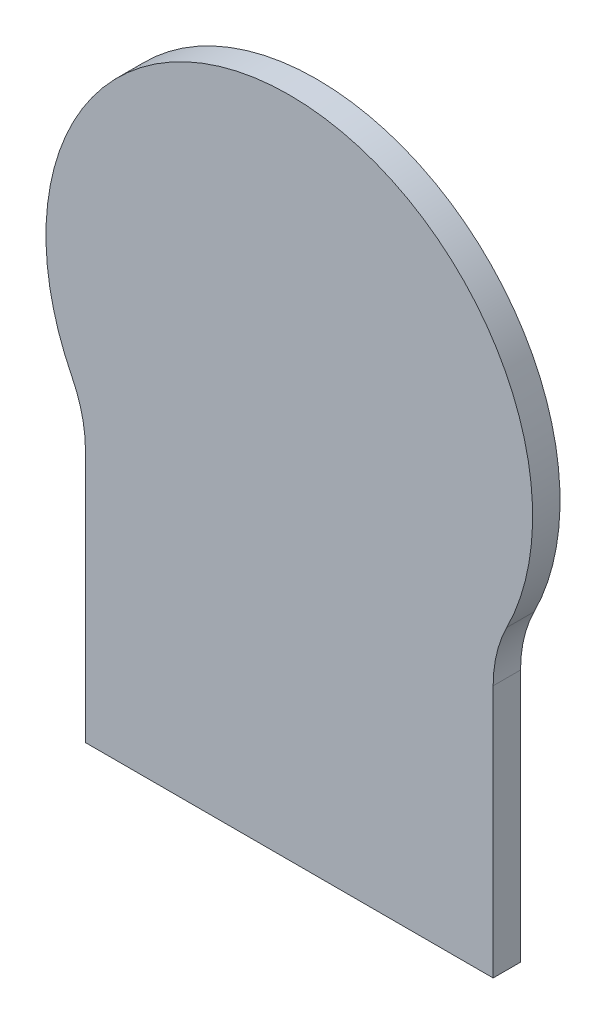
ISO-10303-21;
HEADER;
FILE_DESCRIPTION(('STEP AP214'),'2;1');
FILE_NAME('part.step','',(''),(''),'','','');
FILE_SCHEMA(('AUTOMOTIVE_DESIGN { 1 0 10303 214 1 1 1 1 }'));
ENDSEC;
DATA;
#1=APPLICATION_CONTEXT('core data for automotive mechanical design processes');
#2=APPLICATION_PROTOCOL_DEFINITION('international standard','automotive_design',2000,#1);
#3=PRODUCT_CONTEXT('',#1,'mechanical');
#4=PRODUCT('Part','Part','',(#3));
#5=PRODUCT_RELATED_PRODUCT_CATEGORY('part','',(#4));
#6=PRODUCT_DEFINITION_FORMATION('','',#4);
#7=PRODUCT_DEFINITION_CONTEXT('part definition',#1,'design');
#8=PRODUCT_DEFINITION('design','',#6,#7);
#9=PRODUCT_DEFINITION_SHAPE('','',#8);
#10=(LENGTH_UNIT() NAMED_UNIT(*) SI_UNIT(.MILLI.,.METRE.));
#11=(NAMED_UNIT(*) PLANE_ANGLE_UNIT() SI_UNIT($,.RADIAN.));
#12=(NAMED_UNIT(*) SI_UNIT($,.STERADIAN.) SOLID_ANGLE_UNIT());
#13=UNCERTAINTY_MEASURE_WITH_UNIT(LENGTH_MEASURE(1.E-05),#10,'distance_accuracy_value','');
#14=(GEOMETRIC_REPRESENTATION_CONTEXT(3) GLOBAL_UNCERTAINTY_ASSIGNED_CONTEXT((#13)) GLOBAL_UNIT_ASSIGNED_CONTEXT((#10,
#11,#12)) REPRESENTATION_CONTEXT('',''));
#15=CARTESIAN_POINT('',(0.,0.,0.));
#16=DIRECTION('',(0.,0.,1.));
#17=DIRECTION('',(1.,0.,0.));
#18=AXIS2_PLACEMENT_3D('',#15,#16,#17);
#19=CARTESIAN_POINT('',(0.,0.,0.43));
#20=DIRECTION('',(0.,0.,-1.));
#21=DIRECTION('',(-1.,0.,0.));
#22=AXIS2_PLACEMENT_3D('',#19,#20,#21);
#23=CYLINDRICAL_SURFACE('',#22,3.82);
#24=CARTESIAN_POINT('',(0.,0.,0.));
#25=DIRECTION('',(0.,0.,1.));
#26=DIRECTION('',(1.,0.,0.));
#27=AXIS2_PLACEMENT_3D('',#24,#25,#26);
#28=CIRCLE('',#27,3.82);
#29=CARTESIAN_POINT('',(3.41305841924399,-1.71564338568006,0.));
#30=VERTEX_POINT('',#29);
#31=CARTESIAN_POINT('',(-3.41305841924399,-1.71564338568006,0.));
#32=VERTEX_POINT('',#31);
#33=EDGE_CURVE('E117',#30,#32,#28,.T.);
#34=ORIENTED_EDGE('',*,*,#33,.T.);
#35=DIRECTION('',(0.,0.,-1.));
#36=VECTOR('',#35,1.);
#37=CARTESIAN_POINT('',(-3.41305841924399,-1.71564338568006,0.43));
#38=LINE('',#37,#36);
#39=CARTESIAN_POINT('',(-3.41305841924399,-1.71564338568006,0.43));
#40=VERTEX_POINT('',#39);
#41=EDGE_CURVE('E129',#32,#40,#38,.F.);
#42=ORIENTED_EDGE('',*,*,#41,.T.);
#43=CARTESIAN_POINT('',(0.,0.,0.43));
#44=DIRECTION('',(0.,0.,1.));
#45=DIRECTION('',(1.,0.,0.));
#46=AXIS2_PLACEMENT_3D('',#43,#44,#45);
#47=CIRCLE('',#46,3.82);
#48=CARTESIAN_POINT('',(3.41305841924399,-1.71564338568006,0.43));
#49=VERTEX_POINT('',#48);
#50=EDGE_CURVE('E111',#49,#40,#47,.T.);
#51=ORIENTED_EDGE('',*,*,#50,.F.);
#52=DIRECTION('',(0.,0.,-1.));
#53=VECTOR('',#52,1.);
#54=CARTESIAN_POINT('',(3.41305841924399,-1.71564338568006,0.43));
#55=LINE('',#54,#53);
#56=EDGE_CURVE('E126',#49,#30,#55,.T.);
#57=ORIENTED_EDGE('',*,*,#56,.T.);
#58=EDGE_LOOP('',(#34,#42,#51,#57));
#59=FACE_BOUND('',#58,.T.);
#60=ADVANCED_FACE('F33',(#59),#23,.T.);
#61=CARTESIAN_POINT('',(-3.2,0.,0.43));
#62=DIRECTION('',(-1.,0.,0.));
#63=DIRECTION('',(0.,0.,1.));
#64=AXIS2_PLACEMENT_3D('',#61,#62,#63);
#65=PLANE('',#64);
#66=DIRECTION('',(0.,1.,0.));
#67=VECTOR('',#66,1.);
#68=CARTESIAN_POINT('',(-3.2,0.,0.43));
#69=LINE('',#68,#67);
#70=CARTESIAN_POINT('',(-3.2,-6.58624063808564,0.43));
#71=VERTEX_POINT('',#70);
#72=CARTESIAN_POINT('',(-3.2,-2.61388599598376,0.43));
#73=VERTEX_POINT('',#72);
#74=EDGE_CURVE('E91',#71,#73,#69,.T.);
#75=ORIENTED_EDGE('',*,*,#74,.T.);
#76=DIRECTION('',(0.,0.,-1.));
#77=VECTOR('',#76,1.);
#78=CARTESIAN_POINT('',(-3.2,-2.61388599598376,0.43));
#79=LINE('',#78,#77);
#80=CARTESIAN_POINT('',(-3.2,-2.61388599598376,0.));
#81=VERTEX_POINT('',#80);
#82=EDGE_CURVE('E97',#73,#81,#79,.T.);
#83=ORIENTED_EDGE('',*,*,#82,.T.);
#84=DIRECTION('',(0.,1.,0.));
#85=VECTOR('',#84,1.);
#86=CARTESIAN_POINT('',(-3.2,0.,0.));
#87=LINE('',#86,#85);
#88=CARTESIAN_POINT('',(-3.2,-6.58624063808564,0.));
#89=VERTEX_POINT('',#88);
#90=EDGE_CURVE('E94',#89,#81,#87,.T.);
#91=ORIENTED_EDGE('',*,*,#90,.F.);
#92=DIRECTION('',(0.,0.,-1.));
#93=VECTOR('',#92,1.);
#94=CARTESIAN_POINT('',(-3.2,-6.58624063808564,0.43));
#95=LINE('',#94,#93);
#96=EDGE_CURVE('E86',#71,#89,#95,.T.);
#97=ORIENTED_EDGE('',*,*,#96,.F.);
#98=EDGE_LOOP('',(#75,#83,#91,#97));
#99=FACE_BOUND('',#98,.T.);
#100=ADVANCED_FACE('F88',(#99),#65,.T.);
#101=CARTESIAN_POINT('',(0.,-6.58624063808564,0.43));
#102=DIRECTION('',(0.,1.,0.));
#103=DIRECTION('',(0.,0.,1.));
#104=AXIS2_PLACEMENT_3D('',#101,#102,#103);
#105=PLANE('',#104);
#106=DIRECTION('',(1.,0.,0.));
#107=VECTOR('',#106,1.);
#108=CARTESIAN_POINT('',(0.,-6.58624063808564,0.));
#109=LINE('',#108,#107);
#110=CARTESIAN_POINT('',(3.2,-6.58624063808564,0.));
#111=VERTEX_POINT('',#110);
#112=EDGE_CURVE('E121',#89,#111,#109,.T.);
#113=ORIENTED_EDGE('',*,*,#112,.T.);
#114=DIRECTION('',(0.,0.,-1.));
#115=VECTOR('',#114,1.);
#116=CARTESIAN_POINT('',(3.2,-6.58624063808564,0.43));
#117=LINE('',#116,#115);
#118=CARTESIAN_POINT('',(3.2,-6.58624063808564,0.43));
#119=VERTEX_POINT('',#118);
#120=EDGE_CURVE('E98',#119,#111,#117,.T.);
#121=ORIENTED_EDGE('',*,*,#120,.F.);
#122=DIRECTION('',(1.,0.,0.));
#123=VECTOR('',#122,1.);
#124=CARTESIAN_POINT('',(0.,-6.58624063808564,0.43));
#125=LINE('',#124,#123);
#126=EDGE_CURVE('E101',#71,#119,#125,.T.);
#127=ORIENTED_EDGE('',*,*,#126,.F.);
#128=ORIENTED_EDGE('',*,*,#96,.T.);
#129=EDGE_LOOP('',(#113,#121,#127,#128));
#130=FACE_BOUND('',#129,.T.);
#131=ADVANCED_FACE('F102',(#130),#105,.F.);
#132=CARTESIAN_POINT('',(3.2,0.,0.43));
#133=DIRECTION('',(-1.,0.,0.));
#134=DIRECTION('',(0.,0.,1.));
#135=AXIS2_PLACEMENT_3D('',#132,#133,#134);
#136=PLANE('',#135);
#137=DIRECTION('',(0.,1.,0.));
#138=VECTOR('',#137,1.);
#139=CARTESIAN_POINT('',(3.2,0.,0.));
#140=LINE('',#139,#138);
#141=CARTESIAN_POINT('',(3.2,-2.61388599598376,0.));
#142=VERTEX_POINT('',#141);
#143=EDGE_CURVE('E113',#111,#142,#140,.T.);
#144=ORIENTED_EDGE('',*,*,#143,.T.);
#145=DIRECTION('',(0.,0.,1.));
#146=VECTOR('',#145,1.);
#147=CARTESIAN_POINT('',(3.2,-2.61388599598376,0.43));
#148=LINE('',#147,#146);
#149=CARTESIAN_POINT('',(3.2,-2.61388599598376,0.43));
#150=VERTEX_POINT('',#149);
#151=EDGE_CURVE('E48',#142,#150,#148,.T.);
#152=ORIENTED_EDGE('',*,*,#151,.T.);
#153=DIRECTION('',(0.,1.,0.));
#154=VECTOR('',#153,1.);
#155=CARTESIAN_POINT('',(3.2,0.,0.43));
#156=LINE('',#155,#154);
#157=EDGE_CURVE('E105',#119,#150,#156,.T.);
#158=ORIENTED_EDGE('',*,*,#157,.F.);
#159=ORIENTED_EDGE('',*,*,#120,.T.);
#160=EDGE_LOOP('',(#144,#152,#158,#159));
#161=FACE_BOUND('',#160,.T.);
#162=ADVANCED_FACE('F157',(#161),#136,.F.);
#163=CARTESIAN_POINT('',(0.,0.,0.43));
#164=DIRECTION('',(0.,0.,1.));
#165=DIRECTION('',(1.,0.,0.));
#166=AXIS2_PLACEMENT_3D('',#163,#164,#165);
#167=PLANE('',#166);
#168=ORIENTED_EDGE('',*,*,#157,.T.);
#169=CARTESIAN_POINT('',(5.2,-2.61388599598376,0.43));
#170=DIRECTION('',(0.,0.,1.));
#171=DIRECTION('',(1.,0.,0.));
#172=AXIS2_PLACEMENT_3D('',#169,#170,#171);
#173=CIRCLE('',#172,2.);
#174=EDGE_CURVE('E11',#150,#49,#173,.F.);
#175=ORIENTED_EDGE('',*,*,#174,.T.);
#176=ORIENTED_EDGE('',*,*,#50,.T.);
#177=CARTESIAN_POINT('',(-5.2,-2.61388599598376,0.43));
#178=DIRECTION('',(0.,0.,1.));
#179=DIRECTION('',(1.,0.,0.));
#180=AXIS2_PLACEMENT_3D('',#177,#178,#179);
#181=CIRCLE('',#180,2.);
#182=EDGE_CURVE('E110',#40,#73,#181,.F.);
#183=ORIENTED_EDGE('',*,*,#182,.T.);
#184=ORIENTED_EDGE('',*,*,#74,.F.);
#185=ORIENTED_EDGE('',*,*,#126,.T.);
#186=EDGE_LOOP('',(#168,#175,#176,#183,#184,#185));
#187=FACE_BOUND('',#186,.T.);
#188=ADVANCED_FACE('F107',(#187),#167,.T.);
#189=CARTESIAN_POINT('',(0.,0.,0.));
#190=DIRECTION('',(0.,0.,1.));
#191=DIRECTION('',(1.,0.,0.));
#192=AXIS2_PLACEMENT_3D('',#189,#190,#191);
#193=PLANE('',#192);
#194=ORIENTED_EDGE('',*,*,#33,.F.);
#195=CARTESIAN_POINT('',(5.2,-2.61388599598376,0.));
#196=DIRECTION('',(0.,0.,1.));
#197=DIRECTION('',(1.,0.,0.));
#198=AXIS2_PLACEMENT_3D('',#195,#196,#197);
#199=CIRCLE('',#198,2.);
#200=EDGE_CURVE('E41',#30,#142,#199,.T.);
#201=ORIENTED_EDGE('',*,*,#200,.T.);
#202=ORIENTED_EDGE('',*,*,#143,.F.);
#203=ORIENTED_EDGE('',*,*,#112,.F.);
#204=ORIENTED_EDGE('',*,*,#90,.T.);
#205=CARTESIAN_POINT('',(-5.2,-2.61388599598376,0.));
#206=DIRECTION('',(0.,0.,1.));
#207=DIRECTION('',(1.,0.,0.));
#208=AXIS2_PLACEMENT_3D('',#205,#206,#207);
#209=CIRCLE('',#208,2.);
#210=EDGE_CURVE('E132',#81,#32,#209,.T.);
#211=ORIENTED_EDGE('',*,*,#210,.T.);
#212=EDGE_LOOP('',(#194,#201,#202,#203,#204,#211));
#213=FACE_BOUND('',#212,.T.);
#214=ADVANCED_FACE('F134',(#213),#193,.F.);
#215=CARTESIAN_POINT('',(-5.2,-2.61388599598376,0.43));
#216=DIRECTION('',(0.,0.,-1.));
#217=DIRECTION('',(-1.,0.,0.));
#218=AXIS2_PLACEMENT_3D('',#215,#216,#217);
#219=CYLINDRICAL_SURFACE('',#218,2.);
#220=ORIENTED_EDGE('',*,*,#182,.F.);
#221=ORIENTED_EDGE('',*,*,#41,.F.);
#222=ORIENTED_EDGE('',*,*,#210,.F.);
#223=ORIENTED_EDGE('',*,*,#82,.F.);
#224=EDGE_LOOP('',(#220,#221,#222,#223));
#225=FACE_BOUND('',#224,.T.);
#226=ADVANCED_FACE('F140',(#225),#219,.F.);
#227=CARTESIAN_POINT('',(5.2,-2.61388599598376,0.43));
#228=DIRECTION('',(0.,0.,-1.));
#229=DIRECTION('',(-1.,0.,0.));
#230=AXIS2_PLACEMENT_3D('',#227,#228,#229);
#231=CYLINDRICAL_SURFACE('',#230,2.);
#232=ORIENTED_EDGE('',*,*,#174,.F.);
#233=ORIENTED_EDGE('',*,*,#151,.F.);
#234=ORIENTED_EDGE('',*,*,#200,.F.);
#235=ORIENTED_EDGE('',*,*,#56,.F.);
#236=EDGE_LOOP('',(#232,#233,#234,#235));
#237=FACE_BOUND('',#236,.T.);
#238=ADVANCED_FACE('F35',(#237),#231,.F.);
#239=CLOSED_SHELL('',(#60,#100,#131,#162,#188,#214,#226,#238));
#240=MANIFOLD_SOLID_BREP('B2',#239);
#241=ADVANCED_BREP_SHAPE_REPRESENTATION('',(#18,#240),#14);
#242=SHAPE_DEFINITION_REPRESENTATION(#9,#241);
ENDSEC;
END-ISO-10303-21;
